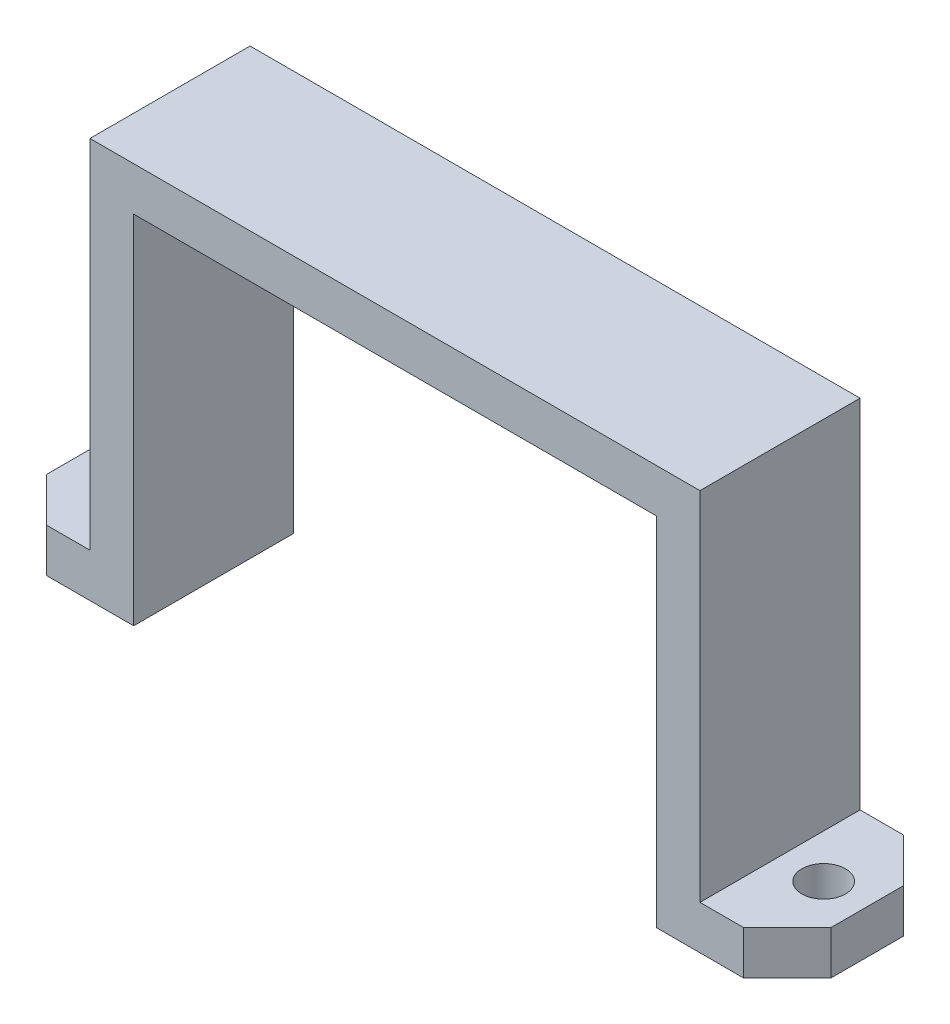
ISO-10303-21;
HEADER;
FILE_DESCRIPTION(('STEP AP214'),'2;1');
FILE_NAME('part.step','',(''),(''),'','','');
FILE_SCHEMA(('AUTOMOTIVE_DESIGN { 1 0 10303 214 1 1 1 1 }'));
ENDSEC;
DATA;
#1=APPLICATION_CONTEXT('core data for automotive mechanical design processes');
#2=APPLICATION_PROTOCOL_DEFINITION('international standard','automotive_design',2000,#1);
#3=PRODUCT_CONTEXT('',#1,'mechanical');
#4=PRODUCT('Part','Part','',(#3));
#5=PRODUCT_RELATED_PRODUCT_CATEGORY('part','',(#4));
#6=PRODUCT_DEFINITION_FORMATION('','',#4);
#7=PRODUCT_DEFINITION_CONTEXT('part definition',#1,'design');
#8=PRODUCT_DEFINITION('design','',#6,#7);
#9=PRODUCT_DEFINITION_SHAPE('','',#8);
#10=(LENGTH_UNIT() NAMED_UNIT(*) SI_UNIT(.MILLI.,.METRE.));
#11=(NAMED_UNIT(*) PLANE_ANGLE_UNIT() SI_UNIT($,.RADIAN.));
#12=(NAMED_UNIT(*) SI_UNIT($,.STERADIAN.) SOLID_ANGLE_UNIT());
#13=UNCERTAINTY_MEASURE_WITH_UNIT(LENGTH_MEASURE(1.E-05),#10,'distance_accuracy_value','');
#14=(GEOMETRIC_REPRESENTATION_CONTEXT(3) GLOBAL_UNCERTAINTY_ASSIGNED_CONTEXT((#13)) GLOBAL_UNIT_ASSIGNED_CONTEXT((#10,
#11,#12)) REPRESENTATION_CONTEXT('',''));
#15=CARTESIAN_POINT('',(0.,0.,0.));
#16=DIRECTION('',(0.,0.,1.));
#17=DIRECTION('',(1.,0.,0.));
#18=AXIS2_PLACEMENT_3D('',#15,#16,#17);
#19=CARTESIAN_POINT('',(-17.955,0.,11.));
#20=DIRECTION('',(-1.,0.,0.));
#21=DIRECTION('',(0.,-1.,0.));
#22=AXIS2_PLACEMENT_3D('',#19,#20,#21);
#23=PLANE('',#22);
#24=DIRECTION('',(0.,1.,0.));
#25=VECTOR('',#24,1.);
#26=CARTESIAN_POINT('',(-17.955,0.,0.));
#27=LINE('',#26,#25);
#28=CARTESIAN_POINT('',(-17.955,0.,0.));
#29=VERTEX_POINT('',#28);
#30=CARTESIAN_POINT('',(-17.955,24.5,0.));
#31=VERTEX_POINT('',#30);
#32=EDGE_CURVE('E179',#29,#31,#27,.T.);
#33=ORIENTED_EDGE('',*,*,#32,.T.);
#34=DIRECTION('',(0.,0.,-1.));
#35=VECTOR('',#34,1.);
#36=CARTESIAN_POINT('',(-17.955,24.5,11.));
#37=LINE('',#36,#35);
#38=CARTESIAN_POINT('',(-17.955,24.5,11.));
#39=VERTEX_POINT('',#38);
#40=EDGE_CURVE('E157',#39,#31,#37,.T.);
#41=ORIENTED_EDGE('',*,*,#40,.F.);
#42=DIRECTION('',(0.,1.,0.));
#43=VECTOR('',#42,1.);
#44=CARTESIAN_POINT('',(-17.955,0.,11.));
#45=LINE('',#44,#43);
#46=CARTESIAN_POINT('',(-17.955,0.,11.));
#47=VERTEX_POINT('',#46);
#48=EDGE_CURVE('E167',#47,#39,#45,.T.);
#49=ORIENTED_EDGE('',*,*,#48,.F.);
#50=DIRECTION('',(0.,0.,-1.));
#51=VECTOR('',#50,1.);
#52=CARTESIAN_POINT('',(-17.955,0.,11.));
#53=LINE('',#52,#51);
#54=EDGE_CURVE('E232',#47,#29,#53,.T.);
#55=ORIENTED_EDGE('',*,*,#54,.T.);
#56=EDGE_LOOP('',(#33,#41,#49,#55));
#57=FACE_BOUND('',#56,.T.);
#58=ADVANCED_FACE('F41',(#57),#23,.F.);
#59=CARTESIAN_POINT('',(-17.955,24.5,11.));
#60=DIRECTION('',(0.,1.,0.));
#61=DIRECTION('',(0.,0.,1.));
#62=AXIS2_PLACEMENT_3D('',#59,#60,#61);
#63=PLANE('',#62);
#64=DIRECTION('',(1.,0.,0.));
#65=VECTOR('',#64,1.);
#66=CARTESIAN_POINT('',(-17.955,24.5,0.));
#67=LINE('',#66,#65);
#68=CARTESIAN_POINT('',(17.955,24.5,0.));
#69=VERTEX_POINT('',#68);
#70=EDGE_CURVE('E280',#31,#69,#67,.T.);
#71=ORIENTED_EDGE('',*,*,#70,.T.);
#72=DIRECTION('',(0.,0.,-1.));
#73=VECTOR('',#72,1.);
#74=CARTESIAN_POINT('',(17.955,24.5,11.));
#75=LINE('',#74,#73);
#76=CARTESIAN_POINT('',(17.955,24.5,11.));
#77=VERTEX_POINT('',#76);
#78=EDGE_CURVE('E165',#77,#69,#75,.T.);
#79=ORIENTED_EDGE('',*,*,#78,.F.);
#80=DIRECTION('',(1.,0.,0.));
#81=VECTOR('',#80,1.);
#82=CARTESIAN_POINT('',(-17.955,24.5,11.));
#83=LINE('',#82,#81);
#84=EDGE_CURVE('E154',#39,#77,#83,.T.);
#85=ORIENTED_EDGE('',*,*,#84,.F.);
#86=ORIENTED_EDGE('',*,*,#40,.T.);
#87=EDGE_LOOP('',(#71,#79,#85,#86));
#88=FACE_BOUND('',#87,.T.);
#89=ADVANCED_FACE('F160',(#88),#63,.F.);
#90=CARTESIAN_POINT('',(17.955,0.,11.));
#91=DIRECTION('',(1.,0.,0.));
#92=DIRECTION('',(0.,1.,0.));
#93=AXIS2_PLACEMENT_3D('',#90,#91,#92);
#94=PLANE('',#93);
#95=DIRECTION('',(0.,-1.,0.));
#96=VECTOR('',#95,1.);
#97=CARTESIAN_POINT('',(17.955,0.,0.));
#98=LINE('',#97,#96);
#99=CARTESIAN_POINT('',(17.955,0.,0.));
#100=VERTEX_POINT('',#99);
#101=EDGE_CURVE('E271',#69,#100,#98,.T.);
#102=ORIENTED_EDGE('',*,*,#101,.T.);
#103=DIRECTION('',(0.,0.,-1.));
#104=VECTOR('',#103,1.);
#105=CARTESIAN_POINT('',(17.955,0.,11.));
#106=LINE('',#105,#104);
#107=CARTESIAN_POINT('',(17.955,0.,11.));
#108=VERTEX_POINT('',#107);
#109=EDGE_CURVE('E183',#108,#100,#106,.T.);
#110=ORIENTED_EDGE('',*,*,#109,.F.);
#111=DIRECTION('',(0.,-1.,0.));
#112=VECTOR('',#111,1.);
#113=CARTESIAN_POINT('',(17.955,0.,11.));
#114=LINE('',#113,#112);
#115=EDGE_CURVE('E164',#77,#108,#114,.T.);
#116=ORIENTED_EDGE('',*,*,#115,.F.);
#117=ORIENTED_EDGE('',*,*,#78,.T.);
#118=EDGE_LOOP('',(#102,#110,#116,#117));
#119=FACE_BOUND('',#118,.T.);
#120=ADVANCED_FACE('F331',(#119),#94,.F.);
#121=CARTESIAN_POINT('',(26.955,0.,11.));
#122=DIRECTION('',(0.,1.,0.));
#123=DIRECTION('',(0.,0.,1.));
#124=AXIS2_PLACEMENT_3D('',#121,#122,#123);
#125=PLANE('',#124);
#126=CARTESIAN_POINT('',(23.955,0.,5.5));
#127=DIRECTION('',(0.,1.,0.));
#128=DIRECTION('',(1.,0.,0.));
#129=AXIS2_PLACEMENT_3D('',#126,#127,#128);
#130=CIRCLE('',#129,1.5);
#131=CARTESIAN_POINT('',(25.455,0.,5.5));
#132=VERTEX_POINT('',#131);
#133=EDGE_CURVE('E304',#132,#132,#130,.T.);
#134=ORIENTED_EDGE('',*,*,#133,.T.);
#135=EDGE_LOOP('',(#134));
#136=FACE_BOUND('',#135,.T.);
#137=DIRECTION('',(1.,0.,0.));
#138=VECTOR('',#137,1.);
#139=CARTESIAN_POINT('',(26.955,0.,0.));
#140=LINE('',#139,#138);
#141=CARTESIAN_POINT('',(23.955,0.,0.));
#142=VERTEX_POINT('',#141);
#143=EDGE_CURVE('E263',#100,#142,#140,.T.);
#144=ORIENTED_EDGE('',*,*,#143,.T.);
#145=DIRECTION('',(0.707106781186548,0.,0.707106781186547));
#146=VECTOR('',#145,1.);
#147=CARTESIAN_POINT('',(26.955,0.,3.));
#148=LINE('',#147,#146);
#149=CARTESIAN_POINT('',(26.955,0.,3.));
#150=VERTEX_POINT('',#149);
#151=EDGE_CURVE('E203',#142,#150,#148,.T.);
#152=ORIENTED_EDGE('',*,*,#151,.T.);
#153=DIRECTION('',(0.,0.,-1.));
#154=VECTOR('',#153,1.);
#155=CARTESIAN_POINT('',(26.955,0.,11.));
#156=LINE('',#155,#154);
#157=CARTESIAN_POINT('',(26.955,0.,7.99999999999999));
#158=VERTEX_POINT('',#157);
#159=EDGE_CURVE('E255',#158,#150,#156,.T.);
#160=ORIENTED_EDGE('',*,*,#159,.F.);
#161=DIRECTION('',(0.707106781186547,0.,-0.707106781186548));
#162=VECTOR('',#161,1.);
#163=CARTESIAN_POINT('',(23.955,0.,11.));
#164=LINE('',#163,#162);
#165=CARTESIAN_POINT('',(23.955,0.,11.));
#166=VERTEX_POINT('',#165);
#167=EDGE_CURVE('E200',#158,#166,#164,.F.);
#168=ORIENTED_EDGE('',*,*,#167,.T.);
#169=DIRECTION('',(1.,0.,0.));
#170=VECTOR('',#169,1.);
#171=CARTESIAN_POINT('',(26.955,0.,11.));
#172=LINE('',#171,#170);
#173=EDGE_CURVE('E264',#108,#166,#172,.T.);
#174=ORIENTED_EDGE('',*,*,#173,.F.);
#175=ORIENTED_EDGE('',*,*,#109,.T.);
#176=EDGE_LOOP('',(#144,#152,#160,#168,#174,#175));
#177=FACE_BOUND('',#176,.T.);
#178=ADVANCED_FACE('F265',(#136,#177),#125,.F.);
#179=CARTESIAN_POINT('',(26.955,3.,11.));
#180=DIRECTION('',(-1.,0.,0.));
#181=DIRECTION('',(0.,0.,1.));
#182=AXIS2_PLACEMENT_3D('',#179,#180,#181);
#183=PLANE('',#182);
#184=ORIENTED_EDGE('',*,*,#159,.T.);
#185=DIRECTION('',(0.,1.,0.));
#186=VECTOR('',#185,1.);
#187=CARTESIAN_POINT('',(26.955,3.,3.));
#188=LINE('',#187,#186);
#189=CARTESIAN_POINT('',(26.955,3.,3.));
#190=VERTEX_POINT('',#189);
#191=EDGE_CURVE('E181',#150,#190,#188,.T.);
#192=ORIENTED_EDGE('',*,*,#191,.T.);
#193=DIRECTION('',(0.,0.,-1.));
#194=VECTOR('',#193,1.);
#195=CARTESIAN_POINT('',(26.955,3.,11.));
#196=LINE('',#195,#194);
#197=CARTESIAN_POINT('',(26.955,3.,7.99999999999999));
#198=VERTEX_POINT('',#197);
#199=EDGE_CURVE('E253',#198,#190,#196,.T.);
#200=ORIENTED_EDGE('',*,*,#199,.F.);
#201=DIRECTION('',(0.,-1.,0.));
#202=VECTOR('',#201,1.);
#203=CARTESIAN_POINT('',(26.955,3.,7.99999999999999));
#204=LINE('',#203,#202);
#205=EDGE_CURVE('E182',#198,#158,#204,.T.);
#206=ORIENTED_EDGE('',*,*,#205,.T.);
#207=EDGE_LOOP('',(#184,#192,#200,#206));
#208=FACE_BOUND('',#207,.T.);
#209=ADVANCED_FACE('F377',(#208),#183,.F.);
#210=CARTESIAN_POINT('',(20.955,3.,11.));
#211=DIRECTION('',(0.,-1.,0.));
#212=DIRECTION('',(1.,0.,0.));
#213=AXIS2_PLACEMENT_3D('',#210,#211,#212);
#214=PLANE('',#213);
#215=CARTESIAN_POINT('',(23.955,3.,5.5));
#216=DIRECTION('',(0.,1.,0.));
#217=DIRECTION('',(1.,0.,0.));
#218=AXIS2_PLACEMENT_3D('',#215,#216,#217);
#219=CIRCLE('',#218,1.5);
#220=CARTESIAN_POINT('',(25.455,3.,5.5));
#221=VERTEX_POINT('',#220);
#222=EDGE_CURVE('E306',#221,#221,#219,.T.);
#223=ORIENTED_EDGE('',*,*,#222,.F.);
#224=EDGE_LOOP('',(#223));
#225=FACE_BOUND('',#224,.T.);
#226=ORIENTED_EDGE('',*,*,#199,.T.);
#227=DIRECTION('',(-0.707106781186548,0.,-0.707106781186547));
#228=VECTOR('',#227,1.);
#229=CARTESIAN_POINT('',(26.955,3.,3.));
#230=LINE('',#229,#228);
#231=CARTESIAN_POINT('',(23.955,3.,0.));
#232=VERTEX_POINT('',#231);
#233=EDGE_CURVE('E193',#190,#232,#230,.T.);
#234=ORIENTED_EDGE('',*,*,#233,.T.);
#235=DIRECTION('',(-1.,0.,0.));
#236=VECTOR('',#235,1.);
#237=CARTESIAN_POINT('',(20.955,3.,0.));
#238=LINE('',#237,#236);
#239=CARTESIAN_POINT('',(20.955,3.,0.));
#240=VERTEX_POINT('',#239);
#241=EDGE_CURVE('E272',#232,#240,#238,.T.);
#242=ORIENTED_EDGE('',*,*,#241,.T.);
#243=DIRECTION('',(0.,0.,-1.));
#244=VECTOR('',#243,1.);
#245=CARTESIAN_POINT('',(20.955,3.,11.));
#246=LINE('',#245,#244);
#247=CARTESIAN_POINT('',(20.955,3.,11.));
#248=VERTEX_POINT('',#247);
#249=EDGE_CURVE('E248',#248,#240,#246,.T.);
#250=ORIENTED_EDGE('',*,*,#249,.F.);
#251=DIRECTION('',(-1.,0.,0.));
#252=VECTOR('',#251,1.);
#253=CARTESIAN_POINT('',(20.955,3.,11.));
#254=LINE('',#253,#252);
#255=CARTESIAN_POINT('',(23.955,3.,11.));
#256=VERTEX_POINT('',#255);
#257=EDGE_CURVE('E301',#256,#248,#254,.T.);
#258=ORIENTED_EDGE('',*,*,#257,.F.);
#259=DIRECTION('',(-0.707106781186547,0.,0.707106781186548));
#260=VECTOR('',#259,1.);
#261=CARTESIAN_POINT('',(23.955,3.,11.));
#262=LINE('',#261,#260);
#263=EDGE_CURVE('E191',#256,#198,#262,.F.);
#264=ORIENTED_EDGE('',*,*,#263,.T.);
#265=EDGE_LOOP('',(#226,#234,#242,#250,#258,#264));
#266=FACE_BOUND('',#265,.T.);
#267=ADVANCED_FACE('F372',(#225,#266),#214,.F.);
#268=CARTESIAN_POINT('',(20.955,27.5,11.));
#269=DIRECTION('',(-1.,0.,0.));
#270=DIRECTION('',(0.,-1.,0.));
#271=AXIS2_PLACEMENT_3D('',#268,#269,#270);
#272=PLANE('',#271);
#273=DIRECTION('',(0.,1.,0.));
#274=VECTOR('',#273,1.);
#275=CARTESIAN_POINT('',(20.955,27.5,0.));
#276=LINE('',#275,#274);
#277=CARTESIAN_POINT('',(20.955,27.5,0.));
#278=VERTEX_POINT('',#277);
#279=EDGE_CURVE('E274',#240,#278,#276,.T.);
#280=ORIENTED_EDGE('',*,*,#279,.T.);
#281=DIRECTION('',(0.,0.,-1.));
#282=VECTOR('',#281,1.);
#283=CARTESIAN_POINT('',(20.955,27.5,11.));
#284=LINE('',#283,#282);
#285=CARTESIAN_POINT('',(20.955,27.5,11.));
#286=VERTEX_POINT('',#285);
#287=EDGE_CURVE('E241',#286,#278,#284,.T.);
#288=ORIENTED_EDGE('',*,*,#287,.F.);
#289=DIRECTION('',(0.,1.,0.));
#290=VECTOR('',#289,1.);
#291=CARTESIAN_POINT('',(20.955,27.5,11.));
#292=LINE('',#291,#290);
#293=EDGE_CURVE('E300',#248,#286,#292,.T.);
#294=ORIENTED_EDGE('',*,*,#293,.F.);
#295=ORIENTED_EDGE('',*,*,#249,.T.);
#296=EDGE_LOOP('',(#280,#288,#294,#295));
#297=FACE_BOUND('',#296,.T.);
#298=ADVANCED_FACE('F367',(#297),#272,.F.);
#299=CARTESIAN_POINT('',(20.955,27.5,11.));
#300=DIRECTION('',(0.,-1.,0.));
#301=DIRECTION('',(0.,0.,-1.));
#302=AXIS2_PLACEMENT_3D('',#299,#300,#301);
#303=PLANE('',#302);
#304=DIRECTION('',(-1.,0.,0.));
#305=VECTOR('',#304,1.);
#306=CARTESIAN_POINT('',(20.955,27.5,0.));
#307=LINE('',#306,#305);
#308=CARTESIAN_POINT('',(-20.955,27.5,0.));
#309=VERTEX_POINT('',#308);
#310=EDGE_CURVE('E284',#278,#309,#307,.T.);
#311=ORIENTED_EDGE('',*,*,#310,.T.);
#312=DIRECTION('',(0.,0.,-1.));
#313=VECTOR('',#312,1.);
#314=CARTESIAN_POINT('',(-20.955,27.5,11.));
#315=LINE('',#314,#313);
#316=CARTESIAN_POINT('',(-20.955,27.5,11.));
#317=VERTEX_POINT('',#316);
#318=EDGE_CURVE('E244',#317,#309,#315,.T.);
#319=ORIENTED_EDGE('',*,*,#318,.F.);
#320=DIRECTION('',(-1.,0.,0.));
#321=VECTOR('',#320,1.);
#322=CARTESIAN_POINT('',(20.955,27.5,11.));
#323=LINE('',#322,#321);
#324=EDGE_CURVE('E299',#286,#317,#323,.T.);
#325=ORIENTED_EDGE('',*,*,#324,.F.);
#326=ORIENTED_EDGE('',*,*,#287,.T.);
#327=EDGE_LOOP('',(#311,#319,#325,#326));
#328=FACE_BOUND('',#327,.T.);
#329=ADVANCED_FACE('F326',(#328),#303,.F.);
#330=CARTESIAN_POINT('',(-20.955,27.5,11.));
#331=DIRECTION('',(1.,0.,0.));
#332=DIRECTION('',(0.,1.,0.));
#333=AXIS2_PLACEMENT_3D('',#330,#331,#332);
#334=PLANE('',#333);
#335=DIRECTION('',(0.,-1.,0.));
#336=VECTOR('',#335,1.);
#337=CARTESIAN_POINT('',(-20.955,27.5,0.));
#338=LINE('',#337,#336);
#339=CARTESIAN_POINT('',(-20.955,3.,0.));
#340=VERTEX_POINT('',#339);
#341=EDGE_CURVE('E285',#309,#340,#338,.T.);
#342=ORIENTED_EDGE('',*,*,#341,.T.);
#343=DIRECTION('',(0.,0.,-1.));
#344=VECTOR('',#343,1.);
#345=CARTESIAN_POINT('',(-20.955,3.,11.));
#346=LINE('',#345,#344);
#347=CARTESIAN_POINT('',(-20.955,3.,11.));
#348=VERTEX_POINT('',#347);
#349=EDGE_CURVE('E237',#348,#340,#346,.T.);
#350=ORIENTED_EDGE('',*,*,#349,.F.);
#351=DIRECTION('',(0.,-1.,0.));
#352=VECTOR('',#351,1.);
#353=CARTESIAN_POINT('',(-20.955,27.5,11.));
#354=LINE('',#353,#352);
#355=EDGE_CURVE('E223',#317,#348,#354,.T.);
#356=ORIENTED_EDGE('',*,*,#355,.F.);
#357=ORIENTED_EDGE('',*,*,#318,.T.);
#358=EDGE_LOOP('',(#342,#350,#356,#357));
#359=FACE_BOUND('',#358,.T.);
#360=ADVANCED_FACE('F320',(#359),#334,.F.);
#361=CARTESIAN_POINT('',(-20.955,3.,11.));
#362=DIRECTION('',(0.,-1.,0.));
#363=DIRECTION('',(1.,0.,0.));
#364=AXIS2_PLACEMENT_3D('',#361,#362,#363);
#365=PLANE('',#364);
#366=CARTESIAN_POINT('',(-23.955,3.,5.5));
#367=DIRECTION('',(0.,1.,0.));
#368=DIRECTION('',(-1.,0.,0.));
#369=AXIS2_PLACEMENT_3D('',#366,#367,#368);
#370=CIRCLE('',#369,1.5);
#371=CARTESIAN_POINT('',(-25.455,3.,5.5));
#372=VERTEX_POINT('',#371);
#373=EDGE_CURVE('E295',#372,#372,#370,.T.);
#374=ORIENTED_EDGE('',*,*,#373,.F.);
#375=EDGE_LOOP('',(#374));
#376=FACE_BOUND('',#375,.T.);
#377=DIRECTION('',(-1.,0.,0.));
#378=VECTOR('',#377,1.);
#379=CARTESIAN_POINT('',(-20.955,3.,0.));
#380=LINE('',#379,#378);
#381=CARTESIAN_POINT('',(-23.955,3.,0.));
#382=VERTEX_POINT('',#381);
#383=EDGE_CURVE('E286',#340,#382,#380,.T.);
#384=ORIENTED_EDGE('',*,*,#383,.T.);
#385=DIRECTION('',(-0.707106781186548,0.,0.707106781186547));
#386=VECTOR('',#385,1.);
#387=CARTESIAN_POINT('',(-26.955,3.,3.));
#388=LINE('',#387,#386);
#389=CARTESIAN_POINT('',(-26.955,3.,3.));
#390=VERTEX_POINT('',#389);
#391=EDGE_CURVE('E11',#382,#390,#388,.T.);
#392=ORIENTED_EDGE('',*,*,#391,.T.);
#393=DIRECTION('',(0.,0.,-1.));
#394=VECTOR('',#393,1.);
#395=CARTESIAN_POINT('',(-26.955,3.,11.));
#396=LINE('',#395,#394);
#397=CARTESIAN_POINT('',(-26.955,3.,7.99999999999999));
#398=VERTEX_POINT('',#397);
#399=EDGE_CURVE('E222',#398,#390,#396,.T.);
#400=ORIENTED_EDGE('',*,*,#399,.F.);
#401=DIRECTION('',(-0.707106781186547,0.,-0.707106781186548));
#402=VECTOR('',#401,1.);
#403=CARTESIAN_POINT('',(-23.955,3.,11.));
#404=LINE('',#403,#402);
#405=CARTESIAN_POINT('',(-23.955,3.,11.));
#406=VERTEX_POINT('',#405);
#407=EDGE_CURVE('E49',#398,#406,#404,.F.);
#408=ORIENTED_EDGE('',*,*,#407,.T.);
#409=DIRECTION('',(-1.,0.,0.));
#410=VECTOR('',#409,1.);
#411=CARTESIAN_POINT('',(-20.955,3.,11.));
#412=LINE('',#411,#410);
#413=EDGE_CURVE('E219',#348,#406,#412,.T.);
#414=ORIENTED_EDGE('',*,*,#413,.F.);
#415=ORIENTED_EDGE('',*,*,#349,.T.);
#416=EDGE_LOOP('',(#384,#392,#400,#408,#414,#415));
#417=FACE_BOUND('',#416,.T.);
#418=ADVANCED_FACE('F217',(#376,#417),#365,.F.);
#419=CARTESIAN_POINT('',(-26.955,3.,11.));
#420=DIRECTION('',(1.,0.,0.));
#421=DIRECTION('',(0.,0.,-1.));
#422=AXIS2_PLACEMENT_3D('',#419,#420,#421);
#423=PLANE('',#422);
#424=ORIENTED_EDGE('',*,*,#399,.T.);
#425=DIRECTION('',(0.,-1.,0.));
#426=VECTOR('',#425,1.);
#427=CARTESIAN_POINT('',(-26.955,0.,3.));
#428=LINE('',#427,#426);
#429=CARTESIAN_POINT('',(-26.955,0.,3.));
#430=VERTEX_POINT('',#429);
#431=EDGE_CURVE('E207',#390,#430,#428,.T.);
#432=ORIENTED_EDGE('',*,*,#431,.T.);
#433=DIRECTION('',(0.,0.,-1.));
#434=VECTOR('',#433,1.);
#435=CARTESIAN_POINT('',(-26.955,0.,11.));
#436=LINE('',#435,#434);
#437=CARTESIAN_POINT('',(-26.955,0.,7.99999999999999));
#438=VERTEX_POINT('',#437);
#439=EDGE_CURVE('E231',#438,#430,#436,.T.);
#440=ORIENTED_EDGE('',*,*,#439,.F.);
#441=DIRECTION('',(0.,1.,0.));
#442=VECTOR('',#441,1.);
#443=CARTESIAN_POINT('',(-26.955,3.,7.99999999999999));
#444=LINE('',#443,#442);
#445=EDGE_CURVE('E64',#438,#398,#444,.T.);
#446=ORIENTED_EDGE('',*,*,#445,.T.);
#447=EDGE_LOOP('',(#424,#432,#440,#446));
#448=FACE_BOUND('',#447,.T.);
#449=ADVANCED_FACE('F235',(#448),#423,.F.);
#450=CARTESIAN_POINT('',(-26.955,0.,11.));
#451=DIRECTION('',(0.,1.,0.));
#452=DIRECTION('',(0.,0.,1.));
#453=AXIS2_PLACEMENT_3D('',#450,#451,#452);
#454=PLANE('',#453);
#455=CARTESIAN_POINT('',(-23.955,0.,5.5));
#456=DIRECTION('',(0.,1.,0.));
#457=DIRECTION('',(-1.,0.,0.));
#458=AXIS2_PLACEMENT_3D('',#455,#456,#457);
#459=CIRCLE('',#458,1.5);
#460=CARTESIAN_POINT('',(-25.455,0.,5.5));
#461=VERTEX_POINT('',#460);
#462=EDGE_CURVE('E287',#461,#461,#459,.T.);
#463=ORIENTED_EDGE('',*,*,#462,.T.);
#464=EDGE_LOOP('',(#463));
#465=FACE_BOUND('',#464,.T.);
#466=ORIENTED_EDGE('',*,*,#439,.T.);
#467=DIRECTION('',(0.707106781186548,0.,-0.707106781186547));
#468=VECTOR('',#467,1.);
#469=CARTESIAN_POINT('',(-26.955,0.,3.));
#470=LINE('',#469,#468);
#471=CARTESIAN_POINT('',(-23.955,0.,0.));
#472=VERTEX_POINT('',#471);
#473=EDGE_CURVE('E212',#430,#472,#470,.T.);
#474=ORIENTED_EDGE('',*,*,#473,.T.);
#475=DIRECTION('',(1.,0.,0.));
#476=VECTOR('',#475,1.);
#477=CARTESIAN_POINT('',(-26.955,0.,0.));
#478=LINE('',#477,#476);
#479=EDGE_CURVE('E180',#472,#29,#478,.T.);
#480=ORIENTED_EDGE('',*,*,#479,.T.);
#481=ORIENTED_EDGE('',*,*,#54,.F.);
#482=DIRECTION('',(1.,0.,0.));
#483=VECTOR('',#482,1.);
#484=CARTESIAN_POINT('',(-26.955,0.,11.));
#485=LINE('',#484,#483);
#486=CARTESIAN_POINT('',(-23.955,0.,11.));
#487=VERTEX_POINT('',#486);
#488=EDGE_CURVE('E172',#487,#47,#485,.T.);
#489=ORIENTED_EDGE('',*,*,#488,.F.);
#490=DIRECTION('',(0.707106781186547,0.,0.707106781186548));
#491=VECTOR('',#490,1.);
#492=CARTESIAN_POINT('',(-23.955,0.,11.));
#493=LINE('',#492,#491);
#494=EDGE_CURVE('E215',#487,#438,#493,.F.);
#495=ORIENTED_EDGE('',*,*,#494,.T.);
#496=EDGE_LOOP('',(#466,#474,#480,#481,#489,#495));
#497=FACE_BOUND('',#496,.T.);
#498=ADVANCED_FACE('F226',(#465,#497),#454,.F.);
#499=CARTESIAN_POINT('',(0.,0.,11.));
#500=DIRECTION('',(0.,0.,-1.));
#501=DIRECTION('',(-1.,0.,0.));
#502=AXIS2_PLACEMENT_3D('',#499,#500,#501);
#503=PLANE('',#502);
#504=ORIENTED_EDGE('',*,*,#173,.T.);
#505=DIRECTION('',(0.,1.,0.));
#506=VECTOR('',#505,1.);
#507=CARTESIAN_POINT('',(23.955,0.,11.));
#508=LINE('',#507,#506);
#509=EDGE_CURVE('E202',#166,#256,#508,.T.);
#510=ORIENTED_EDGE('',*,*,#509,.T.);
#511=ORIENTED_EDGE('',*,*,#257,.T.);
#512=ORIENTED_EDGE('',*,*,#293,.T.);
#513=ORIENTED_EDGE('',*,*,#324,.T.);
#514=ORIENTED_EDGE('',*,*,#355,.T.);
#515=ORIENTED_EDGE('',*,*,#413,.T.);
#516=DIRECTION('',(0.,-1.,0.));
#517=VECTOR('',#516,1.);
#518=CARTESIAN_POINT('',(-23.955,0.,11.));
#519=LINE('',#518,#517);
#520=EDGE_CURVE('E201',#406,#487,#519,.T.);
#521=ORIENTED_EDGE('',*,*,#520,.T.);
#522=ORIENTED_EDGE('',*,*,#488,.T.);
#523=ORIENTED_EDGE('',*,*,#48,.T.);
#524=ORIENTED_EDGE('',*,*,#84,.T.);
#525=ORIENTED_EDGE('',*,*,#115,.T.);
#526=EDGE_LOOP('',(#504,#510,#511,#512,#513,#514,#515,#521,#522,#523,#524,#525));
#527=FACE_BOUND('',#526,.T.);
#528=ADVANCED_FACE('F168',(#527),#503,.F.);
#529=CARTESIAN_POINT('',(0.,0.,0.));
#530=DIRECTION('',(0.,0.,-1.));
#531=DIRECTION('',(-1.,0.,0.));
#532=AXIS2_PLACEMENT_3D('',#529,#530,#531);
#533=PLANE('',#532);
#534=ORIENTED_EDGE('',*,*,#241,.F.);
#535=DIRECTION('',(0.,-1.,0.));
#536=VECTOR('',#535,1.);
#537=CARTESIAN_POINT('',(23.955,0.,0.));
#538=LINE('',#537,#536);
#539=EDGE_CURVE('E197',#232,#142,#538,.T.);
#540=ORIENTED_EDGE('',*,*,#539,.T.);
#541=ORIENTED_EDGE('',*,*,#143,.F.);
#542=ORIENTED_EDGE('',*,*,#101,.F.);
#543=ORIENTED_EDGE('',*,*,#70,.F.);
#544=ORIENTED_EDGE('',*,*,#32,.F.);
#545=ORIENTED_EDGE('',*,*,#479,.F.);
#546=DIRECTION('',(0.,1.,0.));
#547=VECTOR('',#546,1.);
#548=CARTESIAN_POINT('',(-23.955,3.,0.));
#549=LINE('',#548,#547);
#550=EDGE_CURVE('E194',#472,#382,#549,.T.);
#551=ORIENTED_EDGE('',*,*,#550,.T.);
#552=ORIENTED_EDGE('',*,*,#383,.F.);
#553=ORIENTED_EDGE('',*,*,#341,.F.);
#554=ORIENTED_EDGE('',*,*,#310,.F.);
#555=ORIENTED_EDGE('',*,*,#279,.F.);
#556=EDGE_LOOP('',(#534,#540,#541,#542,#543,#544,#545,#551,#552,#553,#554,#555));
#557=FACE_BOUND('',#556,.T.);
#558=ADVANCED_FACE('F269',(#557),#533,.T.);
#559=CARTESIAN_POINT('',(26.955,3.,3.));
#560=DIRECTION('',(0.707106781186547,0.,-0.707106781186548));
#561=DIRECTION('',(0.,-1.,0.));
#562=AXIS2_PLACEMENT_3D('',#559,#560,#561);
#563=PLANE('',#562);
#564=ORIENTED_EDGE('',*,*,#151,.F.);
#565=ORIENTED_EDGE('',*,*,#539,.F.);
#566=ORIENTED_EDGE('',*,*,#233,.F.);
#567=ORIENTED_EDGE('',*,*,#191,.F.);
#568=EDGE_LOOP('',(#564,#565,#566,#567));
#569=FACE_BOUND('',#568,.T.);
#570=ADVANCED_FACE('F340',(#569),#563,.T.);
#571=CARTESIAN_POINT('',(23.955,0.,11.));
#572=DIRECTION('',(-0.707106781186548,0.,-0.707106781186547));
#573=DIRECTION('',(0.,1.,0.));
#574=AXIS2_PLACEMENT_3D('',#571,#572,#573);
#575=PLANE('',#574);
#576=ORIENTED_EDGE('',*,*,#167,.F.);
#577=ORIENTED_EDGE('',*,*,#205,.F.);
#578=ORIENTED_EDGE('',*,*,#263,.F.);
#579=ORIENTED_EDGE('',*,*,#509,.F.);
#580=EDGE_LOOP('',(#576,#577,#578,#579));
#581=FACE_BOUND('',#580,.T.);
#582=ADVANCED_FACE('F344',(#581),#575,.F.);
#583=CARTESIAN_POINT('',(-26.955,3.,3.));
#584=DIRECTION('',(-0.707106781186547,0.,-0.707106781186548));
#585=DIRECTION('',(0.,1.,0.));
#586=AXIS2_PLACEMENT_3D('',#583,#584,#585);
#587=PLANE('',#586);
#588=ORIENTED_EDGE('',*,*,#391,.F.);
#589=ORIENTED_EDGE('',*,*,#550,.F.);
#590=ORIENTED_EDGE('',*,*,#473,.F.);
#591=ORIENTED_EDGE('',*,*,#431,.F.);
#592=EDGE_LOOP('',(#588,#589,#590,#591));
#593=FACE_BOUND('',#592,.T.);
#594=ADVANCED_FACE('F353',(#593),#587,.T.);
#595=CARTESIAN_POINT('',(-23.955,0.,11.));
#596=DIRECTION('',(0.707106781186548,0.,-0.707106781186547));
#597=DIRECTION('',(0.,-1.,0.));
#598=AXIS2_PLACEMENT_3D('',#595,#596,#597);
#599=PLANE('',#598);
#600=ORIENTED_EDGE('',*,*,#407,.F.);
#601=ORIENTED_EDGE('',*,*,#445,.F.);
#602=ORIENTED_EDGE('',*,*,#494,.F.);
#603=ORIENTED_EDGE('',*,*,#520,.F.);
#604=EDGE_LOOP('',(#600,#601,#602,#603));
#605=FACE_BOUND('',#604,.T.);
#606=ADVANCED_FACE('F42',(#605),#599,.F.);
#607=CARTESIAN_POINT('',(-23.955,0.,5.5));
#608=DIRECTION('',(0.,1.,0.));
#609=DIRECTION('',(-1.,0.,0.));
#610=AXIS2_PLACEMENT_3D('',#607,#608,#609);
#611=CYLINDRICAL_SURFACE('',#610,1.5);
#612=ORIENTED_EDGE('',*,*,#462,.F.);
#613=EDGE_LOOP('',(#612));
#614=FACE_BOUND('',#613,.T.);
#615=ORIENTED_EDGE('',*,*,#373,.T.);
#616=EDGE_LOOP('',(#615));
#617=FACE_BOUND('',#616,.T.);
#618=ADVANCED_FACE('F314',(#614,#617),#611,.F.);
#619=CARTESIAN_POINT('',(23.955,0.,5.5));
#620=DIRECTION('',(0.,1.,0.));
#621=DIRECTION('',(-1.,0.,0.));
#622=AXIS2_PLACEMENT_3D('',#619,#620,#621);
#623=CYLINDRICAL_SURFACE('',#622,1.5);
#624=ORIENTED_EDGE('',*,*,#133,.F.);
#625=EDGE_LOOP('',(#624));
#626=FACE_BOUND('',#625,.T.);
#627=ORIENTED_EDGE('',*,*,#222,.T.);
#628=EDGE_LOOP('',(#627));
#629=FACE_BOUND('',#628,.T.);
#630=ADVANCED_FACE('F462',(#626,#629),#623,.F.);
#631=CLOSED_SHELL('',(#58,#89,#120,#178,#209,#267,#298,#329,#360,#418,#449,#498,#528,#558,#570,
#582,#594,#606,#618,#630));
#632=MANIFOLD_SOLID_BREP('B2',#631);
#633=ADVANCED_BREP_SHAPE_REPRESENTATION('',(#18,#632),#14);
#634=SHAPE_DEFINITION_REPRESENTATION(#9,#633);
ENDSEC;
END-ISO-10303-21;
